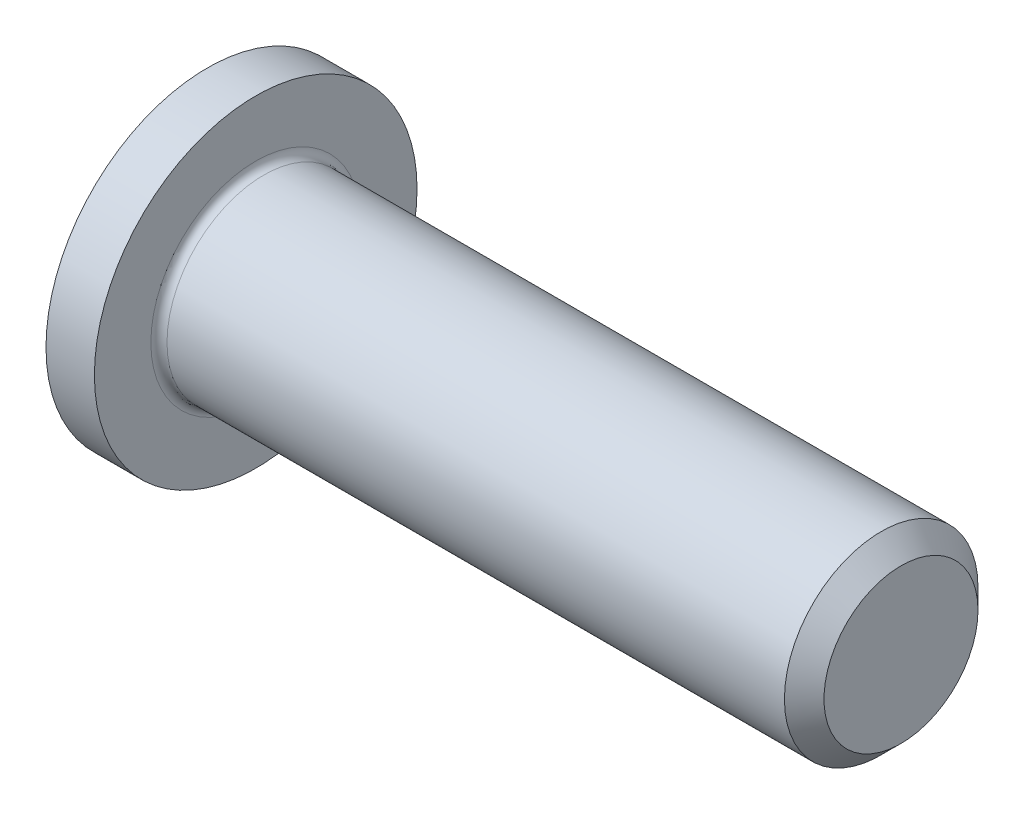
ISO-10303-21;
HEADER;
FILE_DESCRIPTION(('STEP AP214'),'2;1');
FILE_NAME('part.step','',(''),(''),'','','');
FILE_SCHEMA(('AUTOMOTIVE_DESIGN { 1 0 10303 214 1 1 1 1 }'));
ENDSEC;
DATA;
#1=APPLICATION_CONTEXT('core data for automotive mechanical design processes');
#2=APPLICATION_PROTOCOL_DEFINITION('international standard','automotive_design',2000,#1);
#3=PRODUCT_CONTEXT('',#1,'mechanical');
#4=PRODUCT('Part','Part','',(#3));
#5=PRODUCT_RELATED_PRODUCT_CATEGORY('part','',(#4));
#6=PRODUCT_DEFINITION_FORMATION('','',#4);
#7=PRODUCT_DEFINITION_CONTEXT('part definition',#1,'design');
#8=PRODUCT_DEFINITION('design','',#6,#7);
#9=PRODUCT_DEFINITION_SHAPE('','',#8);
#10=(LENGTH_UNIT() NAMED_UNIT(*) SI_UNIT(.MILLI.,.METRE.));
#11=(NAMED_UNIT(*) PLANE_ANGLE_UNIT() SI_UNIT($,.RADIAN.));
#12=(NAMED_UNIT(*) SI_UNIT($,.STERADIAN.) SOLID_ANGLE_UNIT());
#13=UNCERTAINTY_MEASURE_WITH_UNIT(LENGTH_MEASURE(1.E-05),#10,'distance_accuracy_value','');
#14=(GEOMETRIC_REPRESENTATION_CONTEXT(3) GLOBAL_UNCERTAINTY_ASSIGNED_CONTEXT((#13)) GLOBAL_UNIT_ASSIGNED_CONTEXT((#10,
#11,#12)) REPRESENTATION_CONTEXT('',''));
#15=CARTESIAN_POINT('',(0.,0.,0.));
#16=DIRECTION('',(0.,0.,1.));
#17=DIRECTION('',(1.,0.,0.));
#18=AXIS2_PLACEMENT_3D('',#15,#16,#17);
#19=CARTESIAN_POINT('',(-1.5,0.,0.));
#20=DIRECTION('',(1.,0.,0.));
#21=DIRECTION('',(0.,0.,-1.));
#22=AXIS2_PLACEMENT_3D('',#19,#20,#21);
#23=PLANE('',#22);
#24=CARTESIAN_POINT('',(-1.5,0.,0.));
#25=DIRECTION('',(1.,0.,0.));
#26=DIRECTION('',(0.,0.,-1.));
#27=AXIS2_PLACEMENT_3D('',#24,#25,#26);
#28=CIRCLE('',#27,5.);
#29=CARTESIAN_POINT('',(-1.5,0.,-5.));
#30=VERTEX_POINT('',#29);
#31=EDGE_CURVE('E115',#30,#30,#28,.T.);
#32=ORIENTED_EDGE('',*,*,#31,.F.);
#33=EDGE_LOOP('',(#32));
#34=FACE_BOUND('',#33,.T.);
#35=DIRECTION('',(0.,0.500000000000009,-0.866025403784433));
#36=VECTOR('',#35,1.);
#37=CARTESIAN_POINT('',(-1.5,-1.7320508075689,0.));
#38=LINE('',#37,#36);
#39=CARTESIAN_POINT('',(-1.5,-1.7320508075689,0.));
#40=VERTEX_POINT('',#39);
#41=CARTESIAN_POINT('',(-1.5,-0.86602540378444,-1.5));
#42=VERTEX_POINT('',#41);
#43=EDGE_CURVE('E100',#40,#42,#38,.T.);
#44=ORIENTED_EDGE('',*,*,#43,.T.);
#45=DIRECTION('',(0.,1.,0.));
#46=VECTOR('',#45,1.);
#47=CARTESIAN_POINT('',(-1.5,-0.86602540378444,-1.5));
#48=LINE('',#47,#46);
#49=CARTESIAN_POINT('',(-1.5,0.86602540378444,-1.5));
#50=VERTEX_POINT('',#49);
#51=EDGE_CURVE('E88',#42,#50,#48,.T.);
#52=ORIENTED_EDGE('',*,*,#51,.T.);
#53=DIRECTION('',(0.,0.500000000000009,0.866025403784433));
#54=VECTOR('',#53,1.);
#55=CARTESIAN_POINT('',(-1.5,0.86602540378444,-1.5));
#56=LINE('',#55,#54);
#57=CARTESIAN_POINT('',(-1.5,1.7320508075689,0.));
#58=VERTEX_POINT('',#57);
#59=EDGE_CURVE('E99',#50,#58,#56,.T.);
#60=ORIENTED_EDGE('',*,*,#59,.T.);
#61=DIRECTION('',(0.,-0.500000000000009,0.866025403784433));
#62=VECTOR('',#61,1.);
#63=CARTESIAN_POINT('',(-1.5,1.7320508075689,0.));
#64=LINE('',#63,#62);
#65=CARTESIAN_POINT('',(-1.5,0.86602540378444,1.5));
#66=VERTEX_POINT('',#65);
#67=EDGE_CURVE('E125',#58,#66,#64,.T.);
#68=ORIENTED_EDGE('',*,*,#67,.T.);
#69=DIRECTION('',(0.,-1.,0.));
#70=VECTOR('',#69,1.);
#71=CARTESIAN_POINT('',(-1.5,0.86602540378444,1.5));
#72=LINE('',#71,#70);
#73=CARTESIAN_POINT('',(-1.5,-0.86602540378444,1.5));
#74=VERTEX_POINT('',#73);
#75=EDGE_CURVE('E130',#66,#74,#72,.T.);
#76=ORIENTED_EDGE('',*,*,#75,.T.);
#77=DIRECTION('',(0.,-0.500000000000009,-0.866025403784433));
#78=VECTOR('',#77,1.);
#79=CARTESIAN_POINT('',(-1.5,-0.86602540378444,1.5));
#80=LINE('',#79,#78);
#81=EDGE_CURVE('E114',#74,#40,#80,.T.);
#82=ORIENTED_EDGE('',*,*,#81,.T.);
#83=EDGE_LOOP('',(#44,#52,#60,#68,#76,#82));
#84=FACE_BOUND('',#83,.T.);
#85=ADVANCED_FACE('F16',(#34,#84),#23,.F.);
#86=CARTESIAN_POINT('',(20.,0.,0.));
#87=DIRECTION('',(1.,0.,0.));
#88=DIRECTION('',(0.,0.,-1.));
#89=AXIS2_PLACEMENT_3D('',#86,#87,#88);
#90=CYLINDRICAL_SURFACE('',#89,5.);
#91=CARTESIAN_POINT('',(0.,0.,0.));
#92=DIRECTION('',(1.,0.,0.));
#93=DIRECTION('',(0.,0.,-1.));
#94=AXIS2_PLACEMENT_3D('',#91,#92,#93);
#95=CIRCLE('',#94,5.);
#96=CARTESIAN_POINT('',(0.,0.,-5.));
#97=VERTEX_POINT('',#96);
#98=EDGE_CURVE('E137',#97,#97,#95,.T.);
#99=ORIENTED_EDGE('',*,*,#98,.F.);
#100=EDGE_LOOP('',(#99));
#101=FACE_BOUND('',#100,.T.);
#102=ORIENTED_EDGE('',*,*,#31,.T.);
#103=EDGE_LOOP('',(#102));
#104=FACE_BOUND('',#103,.T.);
#105=ADVANCED_FACE('F279',(#101,#104),#90,.T.);
#106=CARTESIAN_POINT('',(2.5,-1.7320508075689,0.));
#107=DIRECTION('',(0.,0.866025403784434,0.500000000000009));
#108=DIRECTION('',(0.,-0.500000000000009,0.866025403784434));
#109=AXIS2_PLACEMENT_3D('',#106,#107,#108);
#110=PLANE('',#109);
#111=ORIENTED_EDGE('',*,*,#43,.F.);
#112=DIRECTION('',(-1.,0.,0.));
#113=VECTOR('',#112,1.);
#114=CARTESIAN_POINT('',(2.5,-1.7320508075689,0.));
#115=LINE('',#114,#113);
#116=CARTESIAN_POINT('',(2.5,-1.7320508075689,0.));
#117=VERTEX_POINT('',#116);
#118=EDGE_CURVE('E142',#117,#40,#115,.T.);
#119=ORIENTED_EDGE('',*,*,#118,.F.);
#120=DIRECTION('',(0.,0.500000000000009,-0.866025403784433));
#121=VECTOR('',#120,1.);
#122=CARTESIAN_POINT('',(2.5,-1.7320508075689,0.));
#123=LINE('',#122,#121);
#124=CARTESIAN_POINT('',(2.5,-1.29903810567665,-0.750000000000014));
#125=VERTEX_POINT('',#124);
#126=EDGE_CURVE('E144',#117,#125,#123,.T.);
#127=ORIENTED_EDGE('',*,*,#126,.T.);
#128=DIRECTION('',(0.,0.500000000000009,-0.866025403784433));
#129=VECTOR('',#128,1.);
#130=CARTESIAN_POINT('',(2.5,-1.29903810567666,-0.750000000000019));
#131=LINE('',#130,#129);
#132=CARTESIAN_POINT('',(2.5,-0.86602540378444,-1.5));
#133=VERTEX_POINT('',#132);
#134=EDGE_CURVE('E109',#125,#133,#131,.T.);
#135=ORIENTED_EDGE('',*,*,#134,.T.);
#136=DIRECTION('',(-1.,0.,0.));
#137=VECTOR('',#136,1.);
#138=CARTESIAN_POINT('',(2.5,-0.86602540378444,-1.5));
#139=LINE('',#138,#137);
#140=EDGE_CURVE('E92',#133,#42,#139,.T.);
#141=ORIENTED_EDGE('',*,*,#140,.T.);
#142=EDGE_LOOP('',(#111,#119,#127,#135,#141));
#143=FACE_BOUND('',#142,.T.);
#144=ADVANCED_FACE('F105',(#143),#110,.T.);
#145=CARTESIAN_POINT('',(2.5,-0.86602540378444,-1.5));
#146=DIRECTION('',(0.,0.,1.));
#147=DIRECTION('',(1.,0.,0.));
#148=AXIS2_PLACEMENT_3D('',#145,#146,#147);
#149=PLANE('',#148);
#150=ORIENTED_EDGE('',*,*,#51,.F.);
#151=ORIENTED_EDGE('',*,*,#140,.F.);
#152=DIRECTION('',(0.,1.,0.));
#153=VECTOR('',#152,1.);
#154=CARTESIAN_POINT('',(2.5,-0.86602540378444,-1.5));
#155=LINE('',#154,#153);
#156=CARTESIAN_POINT('',(2.5,0.,-1.5));
#157=VERTEX_POINT('',#156);
#158=EDGE_CURVE('E110',#133,#157,#155,.T.);
#159=ORIENTED_EDGE('',*,*,#158,.T.);
#160=DIRECTION('',(0.,1.,0.));
#161=VECTOR('',#160,1.);
#162=CARTESIAN_POINT('',(2.5,0.,-1.5));
#163=LINE('',#162,#161);
#164=CARTESIAN_POINT('',(2.5,0.86602540378444,-1.5));
#165=VERTEX_POINT('',#164);
#166=EDGE_CURVE('E156',#157,#165,#163,.T.);
#167=ORIENTED_EDGE('',*,*,#166,.T.);
#168=DIRECTION('',(-1.,0.,0.));
#169=VECTOR('',#168,1.);
#170=CARTESIAN_POINT('',(2.5,0.86602540378444,-1.5));
#171=LINE('',#170,#169);
#172=EDGE_CURVE('E95',#165,#50,#171,.T.);
#173=ORIENTED_EDGE('',*,*,#172,.T.);
#174=EDGE_LOOP('',(#150,#151,#159,#167,#173));
#175=FACE_BOUND('',#174,.T.);
#176=ADVANCED_FACE('F90',(#175),#149,.T.);
#177=CARTESIAN_POINT('',(2.5,0.86602540378444,-1.5));
#178=DIRECTION('',(0.,-0.866025403784434,0.500000000000009));
#179=DIRECTION('',(0.,-0.500000000000009,-0.866025403784434));
#180=AXIS2_PLACEMENT_3D('',#177,#178,#179);
#181=PLANE('',#180);
#182=ORIENTED_EDGE('',*,*,#59,.F.);
#183=ORIENTED_EDGE('',*,*,#172,.F.);
#184=DIRECTION('',(0.,0.500000000000009,0.866025403784433));
#185=VECTOR('',#184,1.);
#186=CARTESIAN_POINT('',(2.5,0.86602540378444,-1.5));
#187=LINE('',#186,#185);
#188=CARTESIAN_POINT('',(2.5,1.29903810567666,-0.750000000000019));
#189=VERTEX_POINT('',#188);
#190=EDGE_CURVE('E163',#165,#189,#187,.T.);
#191=ORIENTED_EDGE('',*,*,#190,.T.);
#192=DIRECTION('',(0.,0.500000000000009,0.866025403784433));
#193=VECTOR('',#192,1.);
#194=CARTESIAN_POINT('',(2.5,1.29903810567666,-0.750000000000018));
#195=LINE('',#194,#193);
#196=CARTESIAN_POINT('',(2.5,1.7320508075689,0.));
#197=VERTEX_POINT('',#196);
#198=EDGE_CURVE('E168',#189,#197,#195,.T.);
#199=ORIENTED_EDGE('',*,*,#198,.T.);
#200=DIRECTION('',(-1.,0.,0.));
#201=VECTOR('',#200,1.);
#202=CARTESIAN_POINT('',(2.5,1.7320508075689,0.));
#203=LINE('',#202,#201);
#204=EDGE_CURVE('E173',#197,#58,#203,.T.);
#205=ORIENTED_EDGE('',*,*,#204,.T.);
#206=EDGE_LOOP('',(#182,#183,#191,#199,#205));
#207=FACE_BOUND('',#206,.T.);
#208=ADVANCED_FACE('F295',(#207),#181,.T.);
#209=CARTESIAN_POINT('',(2.5,1.7320508075689,0.));
#210=DIRECTION('',(0.,-0.866025403784434,-0.500000000000009));
#211=DIRECTION('',(0.,0.500000000000009,-0.866025403784434));
#212=AXIS2_PLACEMENT_3D('',#209,#210,#211);
#213=PLANE('',#212);
#214=ORIENTED_EDGE('',*,*,#67,.F.);
#215=ORIENTED_EDGE('',*,*,#204,.F.);
#216=DIRECTION('',(0.,-0.500000000000009,0.866025403784433));
#217=VECTOR('',#216,1.);
#218=CARTESIAN_POINT('',(2.5,1.7320508075689,0.));
#219=LINE('',#218,#217);
#220=CARTESIAN_POINT('',(2.5,1.29903810567666,0.750000000000019));
#221=VERTEX_POINT('',#220);
#222=EDGE_CURVE('E178',#197,#221,#219,.T.);
#223=ORIENTED_EDGE('',*,*,#222,.T.);
#224=DIRECTION('',(0.,-0.500000000000009,0.866025403784433));
#225=VECTOR('',#224,1.);
#226=CARTESIAN_POINT('',(2.5,1.29903810567666,0.750000000000019));
#227=LINE('',#226,#225);
#228=CARTESIAN_POINT('',(2.5,0.86602540378444,1.5));
#229=VERTEX_POINT('',#228);
#230=EDGE_CURVE('E183',#221,#229,#227,.T.);
#231=ORIENTED_EDGE('',*,*,#230,.T.);
#232=DIRECTION('',(-1.,0.,0.));
#233=VECTOR('',#232,1.);
#234=CARTESIAN_POINT('',(2.5,0.86602540378444,1.5));
#235=LINE('',#234,#233);
#236=EDGE_CURVE('E188',#229,#66,#235,.T.);
#237=ORIENTED_EDGE('',*,*,#236,.T.);
#238=EDGE_LOOP('',(#214,#215,#223,#231,#237));
#239=FACE_BOUND('',#238,.T.);
#240=ADVANCED_FACE('F298',(#239),#213,.T.);
#241=CARTESIAN_POINT('',(2.5,0.86602540378444,1.5));
#242=DIRECTION('',(0.,0.,-1.));
#243=DIRECTION('',(-1.,0.,0.));
#244=AXIS2_PLACEMENT_3D('',#241,#242,#243);
#245=PLANE('',#244);
#246=ORIENTED_EDGE('',*,*,#75,.F.);
#247=ORIENTED_EDGE('',*,*,#236,.F.);
#248=DIRECTION('',(0.,-1.,0.));
#249=VECTOR('',#248,1.);
#250=CARTESIAN_POINT('',(2.5,0.86602540378444,1.5));
#251=LINE('',#250,#249);
#252=CARTESIAN_POINT('',(2.5,0.,1.5));
#253=VERTEX_POINT('',#252);
#254=EDGE_CURVE('E193',#229,#253,#251,.T.);
#255=ORIENTED_EDGE('',*,*,#254,.T.);
#256=DIRECTION('',(0.,-1.,0.));
#257=VECTOR('',#256,1.);
#258=CARTESIAN_POINT('',(2.5,0.,1.5));
#259=LINE('',#258,#257);
#260=CARTESIAN_POINT('',(2.5,-0.86602540378444,1.5));
#261=VERTEX_POINT('',#260);
#262=EDGE_CURVE('E198',#253,#261,#259,.T.);
#263=ORIENTED_EDGE('',*,*,#262,.T.);
#264=DIRECTION('',(-1.,0.,0.));
#265=VECTOR('',#264,1.);
#266=CARTESIAN_POINT('',(2.5,-0.86602540378444,1.5));
#267=LINE('',#266,#265);
#268=EDGE_CURVE('E203',#261,#74,#267,.T.);
#269=ORIENTED_EDGE('',*,*,#268,.T.);
#270=EDGE_LOOP('',(#246,#247,#255,#263,#269));
#271=FACE_BOUND('',#270,.T.);
#272=ADVANCED_FACE('F302',(#271),#245,.T.);
#273=CARTESIAN_POINT('',(2.5,-0.86602540378444,1.5));
#274=DIRECTION('',(0.,0.866025403784434,-0.500000000000009));
#275=DIRECTION('',(0.,0.500000000000009,0.866025403784434));
#276=AXIS2_PLACEMENT_3D('',#273,#274,#275);
#277=PLANE('',#276);
#278=ORIENTED_EDGE('',*,*,#81,.F.);
#279=ORIENTED_EDGE('',*,*,#268,.F.);
#280=DIRECTION('',(0.,-0.500000000000009,-0.866025403784433));
#281=VECTOR('',#280,1.);
#282=CARTESIAN_POINT('',(2.5,-0.86602540378444,1.5));
#283=LINE('',#282,#281);
#284=CARTESIAN_POINT('',(2.5,-1.29903810567666,0.750000000000019));
#285=VERTEX_POINT('',#284);
#286=EDGE_CURVE('E208',#261,#285,#283,.T.);
#287=ORIENTED_EDGE('',*,*,#286,.T.);
#288=DIRECTION('',(0.,-0.500000000000009,-0.866025403784433));
#289=VECTOR('',#288,1.);
#290=CARTESIAN_POINT('',(2.5,-1.29903810567666,0.750000000000018));
#291=LINE('',#290,#289);
#292=EDGE_CURVE('E213',#285,#117,#291,.T.);
#293=ORIENTED_EDGE('',*,*,#292,.T.);
#294=ORIENTED_EDGE('',*,*,#118,.T.);
#295=EDGE_LOOP('',(#278,#279,#287,#293,#294));
#296=FACE_BOUND('',#295,.T.);
#297=ADVANCED_FACE('F275',(#296),#277,.T.);
#298=CARTESIAN_POINT('',(0.,5.,0.));
#299=DIRECTION('',(-1.,0.,0.));
#300=DIRECTION('',(0.,0.,1.));
#301=AXIS2_PLACEMENT_3D('',#298,#299,#300);
#302=PLANE('',#301);
#303=CARTESIAN_POINT('',(0.,0.,0.));
#304=DIRECTION('',(1.,0.,0.));
#305=DIRECTION('',(0.,0.,-1.));
#306=AXIS2_PLACEMENT_3D('',#303,#304,#305);
#307=CIRCLE('',#306,3.25000000000006);
#308=CARTESIAN_POINT('',(0.,0.,-3.25000000000006));
#309=VERTEX_POINT('',#308);
#310=EDGE_CURVE('E218',#309,#309,#307,.T.);
#311=ORIENTED_EDGE('',*,*,#310,.F.);
#312=EDGE_LOOP('',(#311));
#313=FACE_BOUND('',#312,.T.);
#314=ORIENTED_EDGE('',*,*,#98,.T.);
#315=EDGE_LOOP('',(#314));
#316=FACE_BOUND('',#315,.T.);
#317=ADVANCED_FACE('F271',(#313,#316),#302,.F.);
#318=CARTESIAN_POINT('',(2.5,0.,0.));
#319=DIRECTION('',(1.,0.,0.));
#320=DIRECTION('',(0.,0.,-1.));
#321=AXIS2_PLACEMENT_3D('',#318,#319,#320);
#322=PLANE('',#321);
#323=CARTESIAN_POINT('',(2.5,0.,0.));
#324=DIRECTION('',(1.,0.,0.));
#325=DIRECTION('',(0.,-0.866025403784433,0.500000000000009));
#326=AXIS2_PLACEMENT_3D('',#323,#324,#325);
#327=CIRCLE('',#326,1.5);
#328=EDGE_CURVE('E34',#285,#125,#327,.T.);
#329=ORIENTED_EDGE('',*,*,#328,.T.);
#330=ORIENTED_EDGE('',*,*,#126,.F.);
#331=ORIENTED_EDGE('',*,*,#292,.F.);
#332=EDGE_LOOP('',(#329,#330,#331));
#333=FACE_BOUND('',#332,.T.);
#334=ADVANCED_FACE('F274',(#333),#322,.F.);
#335=CARTESIAN_POINT('',(2.5,0.,0.));
#336=DIRECTION('',(1.,0.,0.));
#337=DIRECTION('',(0.,-0.866025403784433,-0.500000000000009));
#338=AXIS2_PLACEMENT_3D('',#335,#336,#337);
#339=CIRCLE('',#338,1.5);
#340=EDGE_CURVE('E224',#125,#157,#339,.T.);
#341=ORIENTED_EDGE('',*,*,#340,.T.);
#342=ORIENTED_EDGE('',*,*,#158,.F.);
#343=ORIENTED_EDGE('',*,*,#134,.F.);
#344=EDGE_LOOP('',(#341,#342,#343));
#345=FACE_BOUND('',#344,.T.);
#346=ADVANCED_FACE('F311',(#345),#322,.F.);
#347=CARTESIAN_POINT('',(2.5,0.,0.));
#348=DIRECTION('',(1.,0.,0.));
#349=DIRECTION('',(0.,0.,-1.));
#350=AXIS2_PLACEMENT_3D('',#347,#348,#349);
#351=CIRCLE('',#350,1.5);
#352=EDGE_CURVE('E229',#157,#189,#351,.T.);
#353=ORIENTED_EDGE('',*,*,#352,.T.);
#354=ORIENTED_EDGE('',*,*,#190,.F.);
#355=ORIENTED_EDGE('',*,*,#166,.F.);
#356=EDGE_LOOP('',(#353,#354,#355));
#357=FACE_BOUND('',#356,.T.);
#358=ADVANCED_FACE('F379',(#357),#322,.F.);
#359=CARTESIAN_POINT('',(2.5,0.,0.));
#360=DIRECTION('',(1.,0.,0.));
#361=DIRECTION('',(0.,0.866025403784433,-0.500000000000009));
#362=AXIS2_PLACEMENT_3D('',#359,#360,#361);
#363=CIRCLE('',#362,1.5);
#364=EDGE_CURVE('E234',#189,#221,#363,.T.);
#365=ORIENTED_EDGE('',*,*,#364,.T.);
#366=ORIENTED_EDGE('',*,*,#222,.F.);
#367=ORIENTED_EDGE('',*,*,#198,.F.);
#368=EDGE_LOOP('',(#365,#366,#367));
#369=FACE_BOUND('',#368,.T.);
#370=ADVANCED_FACE('F370',(#369),#322,.F.);
#371=CARTESIAN_POINT('',(2.5,0.,0.));
#372=DIRECTION('',(1.,0.,0.));
#373=DIRECTION('',(0.,0.866025403784434,0.500000000000009));
#374=AXIS2_PLACEMENT_3D('',#371,#372,#373);
#375=CIRCLE('',#374,1.5);
#376=EDGE_CURVE('E239',#221,#253,#375,.T.);
#377=ORIENTED_EDGE('',*,*,#376,.T.);
#378=ORIENTED_EDGE('',*,*,#254,.F.);
#379=ORIENTED_EDGE('',*,*,#230,.F.);
#380=EDGE_LOOP('',(#377,#378,#379));
#381=FACE_BOUND('',#380,.T.);
#382=ADVANCED_FACE('F361',(#381),#322,.F.);
#383=CARTESIAN_POINT('',(2.5,0.,0.));
#384=DIRECTION('',(1.,0.,0.));
#385=DIRECTION('',(0.,0.,1.));
#386=AXIS2_PLACEMENT_3D('',#383,#384,#385);
#387=CIRCLE('',#386,1.5);
#388=EDGE_CURVE('E244',#253,#285,#387,.T.);
#389=ORIENTED_EDGE('',*,*,#388,.T.);
#390=ORIENTED_EDGE('',*,*,#286,.F.);
#391=ORIENTED_EDGE('',*,*,#262,.F.);
#392=EDGE_LOOP('',(#389,#390,#391));
#393=FACE_BOUND('',#392,.T.);
#394=ADVANCED_FACE('F267',(#393),#322,.F.);
#395=CARTESIAN_POINT('',(0.250000000000063,0.,0.));
#396=DIRECTION('',(1.,0.,0.));
#397=DIRECTION('',(0.,0.,-1.));
#398=AXIS2_PLACEMENT_3D('',#395,#396,#397);
#399=TOROIDAL_SURFACE('',#398,3.25000000000006,0.250000000000063);
#400=CARTESIAN_POINT('',(0.25,0.,0.));
#401=DIRECTION('',(1.,0.,0.));
#402=DIRECTION('',(0.,0.,-1.));
#403=AXIS2_PLACEMENT_3D('',#400,#401,#402);
#404=CIRCLE('',#403,3.);
#405=CARTESIAN_POINT('',(0.25,0.,-3.));
#406=VERTEX_POINT('',#405);
#407=EDGE_CURVE('E248',#406,#406,#404,.T.);
#408=ORIENTED_EDGE('',*,*,#407,.F.);
#409=EDGE_LOOP('',(#408));
#410=FACE_BOUND('',#409,.T.);
#411=ORIENTED_EDGE('',*,*,#310,.T.);
#412=EDGE_LOOP('',(#411));
#413=FACE_BOUND('',#412,.T.);
#414=ADVANCED_FACE('F264',(#410,#413),#399,.F.);
#415=CARTESIAN_POINT('',(2.5,0.,0.));
#416=DIRECTION('',(-1.,0.,0.));
#417=DIRECTION('',(0.,0.,1.));
#418=AXIS2_PLACEMENT_3D('',#415,#416,#417);
#419=CONICAL_SURFACE('',#418,1.5,1.04719755119662);
#420=CARTESIAN_POINT('',(3.3660254037844,0.,0.));
#421=VERTEX_POINT('',#420);
#422=VERTEX_LOOP('',#421);
#423=FACE_BOUND('',#422,.T.);
#424=ORIENTED_EDGE('',*,*,#352,.F.);
#425=ORIENTED_EDGE('',*,*,#340,.F.);
#426=ORIENTED_EDGE('',*,*,#328,.F.);
#427=ORIENTED_EDGE('',*,*,#388,.F.);
#428=ORIENTED_EDGE('',*,*,#376,.F.);
#429=ORIENTED_EDGE('',*,*,#364,.F.);
#430=EDGE_LOOP('',(#424,#425,#426,#427,#428,#429));
#431=FACE_BOUND('',#430,.T.);
#432=ADVANCED_FACE('F260',(#423,#431),#419,.F.);
#433=CARTESIAN_POINT('',(20.,0.,0.));
#434=DIRECTION('',(1.,0.,0.));
#435=DIRECTION('',(0.,0.,-1.));
#436=AXIS2_PLACEMENT_3D('',#433,#434,#435);
#437=CYLINDRICAL_SURFACE('',#436,3.);
#438=CARTESIAN_POINT('',(19.3865,0.,0.));
#439=DIRECTION('',(1.,0.,0.));
#440=DIRECTION('',(0.,0.,-1.));
#441=AXIS2_PLACEMENT_3D('',#438,#439,#440);
#442=CIRCLE('',#441,3.);
#443=CARTESIAN_POINT('',(19.3865,0.,-3.));
#444=VERTEX_POINT('',#443);
#445=EDGE_CURVE('E24',#444,#444,#442,.T.);
#446=ORIENTED_EDGE('',*,*,#445,.F.);
#447=EDGE_LOOP('',(#446));
#448=FACE_BOUND('',#447,.T.);
#449=ORIENTED_EDGE('',*,*,#407,.T.);
#450=EDGE_LOOP('',(#449));
#451=FACE_BOUND('',#450,.T.);
#452=ADVANCED_FACE('F257',(#448,#451),#437,.T.);
#453=CARTESIAN_POINT('',(19.3865,0.,0.));
#454=DIRECTION('',(-1.,0.,0.));
#455=DIRECTION('',(0.,0.,1.));
#456=AXIS2_PLACEMENT_3D('',#453,#454,#455);
#457=CONICAL_SURFACE('',#456,3.,0.785398163397449);
#458=CARTESIAN_POINT('',(20.,0.,0.));
#459=DIRECTION('',(1.,0.,0.));
#460=DIRECTION('',(0.,0.,-1.));
#461=AXIS2_PLACEMENT_3D('',#458,#459,#460);
#462=CIRCLE('',#461,2.3865);
#463=CARTESIAN_POINT('',(20.,0.,-2.3865));
#464=VERTEX_POINT('',#463);
#465=EDGE_CURVE('E11',#464,#464,#462,.T.);
#466=ORIENTED_EDGE('',*,*,#465,.F.);
#467=EDGE_LOOP('',(#466));
#468=FACE_BOUND('',#467,.T.);
#469=ORIENTED_EDGE('',*,*,#445,.T.);
#470=EDGE_LOOP('',(#469));
#471=FACE_BOUND('',#470,.T.);
#472=ADVANCED_FACE('F255',(#468,#471),#457,.T.);
#473=CARTESIAN_POINT('',(20.,2.3865,0.));
#474=DIRECTION('',(-1.,0.,0.));
#475=DIRECTION('',(0.,0.,1.));
#476=AXIS2_PLACEMENT_3D('',#473,#474,#475);
#477=PLANE('',#476);
#478=ORIENTED_EDGE('',*,*,#465,.T.);
#479=EDGE_LOOP('',(#478));
#480=FACE_BOUND('',#479,.T.);
#481=ADVANCED_FACE('F18',(#480),#477,.F.);
#482=CLOSED_SHELL('',(#85,#105,#144,#176,#208,#240,#272,#297,#317,#334,#346,#358,#370,#382,#394,
#414,#432,#452,#472,#481));
#483=MANIFOLD_SOLID_BREP('B1',#482);
#484=ADVANCED_BREP_SHAPE_REPRESENTATION('',(#18,#483),#14);
#485=SHAPE_DEFINITION_REPRESENTATION(#9,#484);
ENDSEC;
END-ISO-10303-21;
